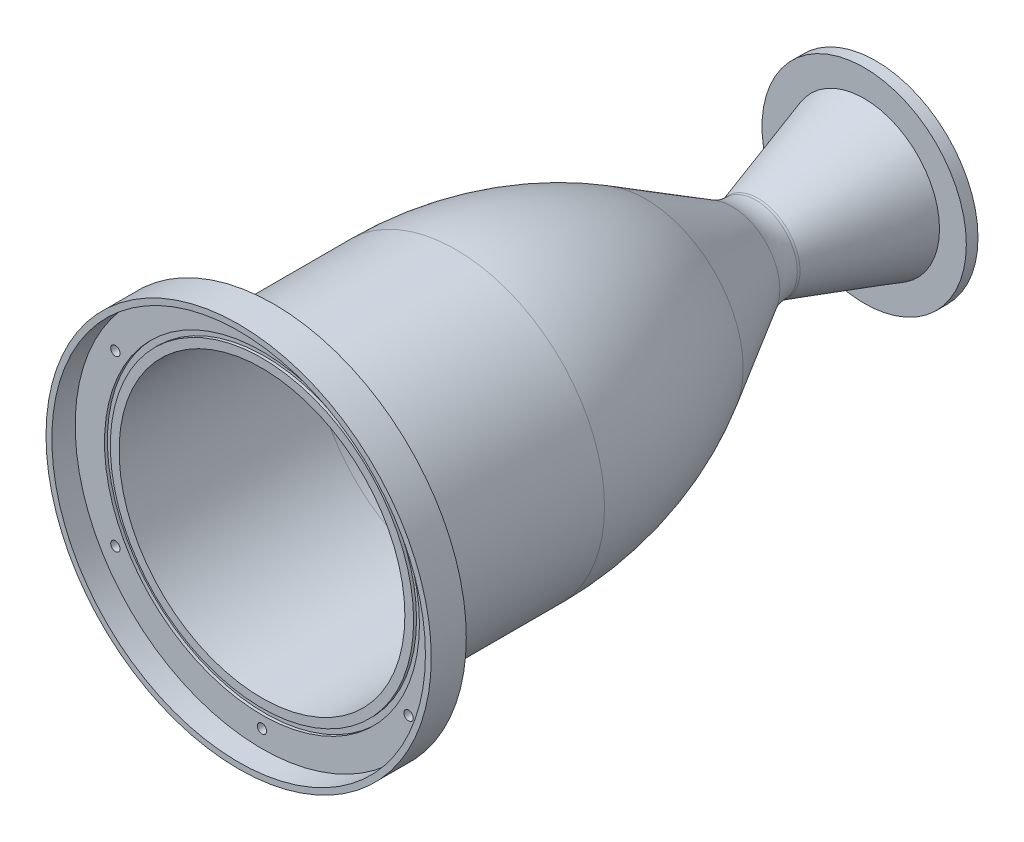
ISO-10303-21;
HEADER;
FILE_DESCRIPTION(('STEP AP214'),'2;1');
FILE_NAME('part.step','',(''),(''),'','','');
FILE_SCHEMA(('AUTOMOTIVE_DESIGN { 1 0 10303 214 1 1 1 1 }'));
ENDSEC;
DATA;
#1=APPLICATION_CONTEXT('core data for automotive mechanical design processes');
#2=APPLICATION_PROTOCOL_DEFINITION('international standard','automotive_design',2000,#1);
#3=PRODUCT_CONTEXT('',#1,'mechanical');
#4=PRODUCT('Part','Part','',(#3));
#5=PRODUCT_RELATED_PRODUCT_CATEGORY('part','',(#4));
#6=PRODUCT_DEFINITION_FORMATION('','',#4);
#7=PRODUCT_DEFINITION_CONTEXT('part definition',#1,'design');
#8=PRODUCT_DEFINITION('design','',#6,#7);
#9=PRODUCT_DEFINITION_SHAPE('','',#8);
#10=(LENGTH_UNIT() NAMED_UNIT(*) SI_UNIT(.MILLI.,.METRE.));
#11=(NAMED_UNIT(*) PLANE_ANGLE_UNIT() SI_UNIT($,.RADIAN.));
#12=(NAMED_UNIT(*) SI_UNIT($,.STERADIAN.) SOLID_ANGLE_UNIT());
#13=UNCERTAINTY_MEASURE_WITH_UNIT(LENGTH_MEASURE(1.E-05),#10,'distance_accuracy_value','');
#14=(GEOMETRIC_REPRESENTATION_CONTEXT(3) GLOBAL_UNCERTAINTY_ASSIGNED_CONTEXT((#13)) GLOBAL_UNIT_ASSIGNED_CONTEXT((#10,
#11,#12)) REPRESENTATION_CONTEXT('',''));
#15=CARTESIAN_POINT('',(0.,0.,0.));
#16=DIRECTION('',(0.,0.,1.));
#17=DIRECTION('',(1.,0.,0.));
#18=AXIS2_PLACEMENT_3D('',#15,#16,#17);
#19=CARTESIAN_POINT('',(0.,24.479181,0.));
#20=DIRECTION('',(0.,0.,-1.));
#21=DIRECTION('',(-1.,0.,0.));
#22=AXIS2_PLACEMENT_3D('',#19,#20,#21);
#23=PLANE('',#22);
#24=CARTESIAN_POINT('',(0.,0.,0.));
#25=DIRECTION('',(0.,0.,1.));
#26=DIRECTION('',(1.,0.,0.));
#27=AXIS2_PLACEMENT_3D('',#24,#25,#26);
#28=CIRCLE('',#27,25.9791805);
#29=CARTESIAN_POINT('',(25.9791805,0.,0.));
#30=VERTEX_POINT('',#29);
#31=EDGE_CURVE('E136',#30,#30,#28,.T.);
#32=ORIENTED_EDGE('',*,*,#31,.T.);
#33=EDGE_LOOP('',(#32));
#34=FACE_BOUND('',#33,.T.);
#35=CARTESIAN_POINT('',(0.,0.,0.));
#36=DIRECTION('',(0.,0.,1.));
#37=DIRECTION('',(1.,0.,0.));
#38=AXIS2_PLACEMENT_3D('',#35,#36,#37);
#39=CIRCLE('',#38,24.479181);
#40=CARTESIAN_POINT('',(24.479181,0.,0.));
#41=VERTEX_POINT('',#40);
#42=EDGE_CURVE('E11',#41,#41,#39,.T.);
#43=ORIENTED_EDGE('',*,*,#42,.F.);
#44=EDGE_LOOP('',(#43));
#45=FACE_BOUND('',#44,.T.);
#46=ADVANCED_FACE('F40',(#34,#45),#23,.F.);
#47=CARTESIAN_POINT('',(0.,0.,0.));
#48=DIRECTION('',(0.,0.,1.));
#49=DIRECTION('',(1.,0.,0.));
#50=AXIS2_PLACEMENT_3D('',#47,#48,#49);
#51=CIRCLE('',#50,26.9791805);
#52=CARTESIAN_POINT('',(26.9791805,0.,0.));
#53=VERTEX_POINT('',#52);
#54=EDGE_CURVE('E455',#53,#53,#51,.T.);
#55=ORIENTED_EDGE('',*,*,#54,.F.);
#56=EDGE_LOOP('',(#55));
#57=FACE_BOUND('',#56,.T.);
#58=CARTESIAN_POINT('',(-25.1147367097486,14.5000000000003,0.));
#59=DIRECTION('',(0.,0.,1.));
#60=DIRECTION('',(1.,0.,0.));
#61=AXIS2_PLACEMENT_3D('',#58,#59,#60);
#62=CIRCLE('',#61,0.799999999999988);
#63=CARTESIAN_POINT('',(-24.3147367097486,14.5000000000003,0.));
#64=VERTEX_POINT('',#63);
#65=EDGE_CURVE('E138',#64,#64,#62,.T.);
#66=ORIENTED_EDGE('',*,*,#65,.F.);
#67=EDGE_LOOP('',(#66));
#68=FACE_BOUND('',#67,.T.);
#69=CARTESIAN_POINT('',(-25.1147367097489,-14.4999999999998,0.));
#70=DIRECTION('',(0.,0.,1.));
#71=DIRECTION('',(1.,0.,0.));
#72=AXIS2_PLACEMENT_3D('',#69,#70,#71);
#73=CIRCLE('',#72,0.799999999999988);
#74=CARTESIAN_POINT('',(-24.3147367097489,-14.4999999999998,0.));
#75=VERTEX_POINT('',#74);
#76=EDGE_CURVE('E76',#75,#75,#73,.T.);
#77=ORIENTED_EDGE('',*,*,#76,.F.);
#78=EDGE_LOOP('',(#77));
#79=FACE_BOUND('',#78,.T.);
#80=CARTESIAN_POINT('',(0.,-29.,0.));
#81=DIRECTION('',(0.,0.,1.));
#82=DIRECTION('',(1.,0.,0.));
#83=AXIS2_PLACEMENT_3D('',#80,#81,#82);
#84=CIRCLE('',#83,0.799999999999987);
#85=CARTESIAN_POINT('',(0.799999999999987,-29.,0.));
#86=VERTEX_POINT('',#85);
#87=EDGE_CURVE('E64',#86,#86,#84,.T.);
#88=ORIENTED_EDGE('',*,*,#87,.F.);
#89=EDGE_LOOP('',(#88));
#90=FACE_BOUND('',#89,.T.);
#91=CARTESIAN_POINT('',(25.1147367097487,-14.5000000000001,0.));
#92=DIRECTION('',(0.,0.,1.));
#93=DIRECTION('',(1.,0.,0.));
#94=AXIS2_PLACEMENT_3D('',#91,#92,#93);
#95=CIRCLE('',#94,0.799999999999988);
#96=CARTESIAN_POINT('',(25.9147367097486,-14.5000000000001,0.));
#97=VERTEX_POINT('',#96);
#98=EDGE_CURVE('E63',#97,#97,#95,.T.);
#99=ORIENTED_EDGE('',*,*,#98,.F.);
#100=EDGE_LOOP('',(#99));
#101=FACE_BOUND('',#100,.T.);
#102=CARTESIAN_POINT('',(25.1147367097488,14.4999999999999,0.));
#103=DIRECTION('',(0.,0.,1.));
#104=DIRECTION('',(1.,0.,0.));
#105=AXIS2_PLACEMENT_3D('',#102,#103,#104);
#106=CIRCLE('',#105,0.799999999999988);
#107=CARTESIAN_POINT('',(25.9147367097487,14.4999999999999,0.));
#108=VERTEX_POINT('',#107);
#109=EDGE_CURVE('E82',#108,#108,#106,.T.);
#110=ORIENTED_EDGE('',*,*,#109,.F.);
#111=EDGE_LOOP('',(#110));
#112=FACE_BOUND('',#111,.T.);
#113=CARTESIAN_POINT('',(0.,29.,0.));
#114=DIRECTION('',(0.,0.,1.));
#115=DIRECTION('',(1.,0.,0.));
#116=AXIS2_PLACEMENT_3D('',#113,#114,#115);
#117=CIRCLE('',#116,0.799999999999987);
#118=CARTESIAN_POINT('',(0.799999999999987,29.,0.));
#119=VERTEX_POINT('',#118);
#120=EDGE_CURVE('E60',#119,#119,#117,.T.);
#121=ORIENTED_EDGE('',*,*,#120,.F.);
#122=EDGE_LOOP('',(#121));
#123=FACE_BOUND('',#122,.T.);
#124=CARTESIAN_POINT('',(0.,0.,0.));
#125=DIRECTION('',(0.,0.,1.));
#126=DIRECTION('',(1.,0.,0.));
#127=AXIS2_PLACEMENT_3D('',#124,#125,#126);
#128=CIRCLE('',#127,32.);
#129=CARTESIAN_POINT('',(32.,0.,0.));
#130=VERTEX_POINT('',#129);
#131=EDGE_CURVE('E59',#130,#130,#128,.T.);
#132=ORIENTED_EDGE('',*,*,#131,.T.);
#133=EDGE_LOOP('',(#132));
#134=FACE_BOUND('',#133,.T.);
#135=ADVANCED_FACE('F42',(#57,#68,#79,#90,#101,#112,#123,#134),#23,.F.);
#136=CARTESIAN_POINT('',(0.,0.,0.));
#137=DIRECTION('',(0.,0.,1.));
#138=DIRECTION('',(1.,0.,0.));
#139=AXIS2_PLACEMENT_3D('',#136,#137,#138);
#140=CYLINDRICAL_SURFACE('',#139,24.4791805);
#141=CARTESIAN_POINT('',(0.,0.,-33.202143));
#142=DIRECTION('',(0.,0.,1.));
#143=DIRECTION('',(1.,0.,0.));
#144=AXIS2_PLACEMENT_3D('',#141,#142,#143);
#145=CIRCLE('',#144,24.47918);
#146=CARTESIAN_POINT('',(24.47918,0.,-33.202143));
#147=VERTEX_POINT('',#146);
#148=EDGE_CURVE('E48',#147,#147,#145,.T.);
#149=ORIENTED_EDGE('',*,*,#148,.F.);
#150=EDGE_LOOP('',(#149));
#151=FACE_BOUND('',#150,.T.);
#152=ORIENTED_EDGE('',*,*,#42,.T.);
#153=EDGE_LOOP('',(#152));
#154=FACE_BOUND('',#153,.T.);
#155=ADVANCED_FACE('F120',(#151,#154),#140,.F.);
#156=CARTESIAN_POINT('',(0.,0.,-33.202143));
#157=DIRECTION('',(0.,0.,1.));
#158=DIRECTION('',(1.,0.,0.));
#159=AXIS2_PLACEMENT_3D('',#156,#157,#158);
#160=DEGENERATE_TOROIDAL_SURFACE('',#159,39.449133,63.928313,.F.);
#161=CARTESIAN_POINT('',(0.,0.,-65.1662995));
#162=DIRECTION('',(0.,0.,1.));
#163=DIRECTION('',(1.,0.,0.));
#164=AXIS2_PLACEMENT_3D('',#161,#162,#163);
#165=CIRCLE('',#164,15.914410079083);
#166=CARTESIAN_POINT('',(15.914410079083,0.,-65.1662995));
#167=VERTEX_POINT('',#166);
#168=EDGE_CURVE('E53',#167,#167,#165,.T.);
#169=ORIENTED_EDGE('',*,*,#168,.F.);
#170=EDGE_LOOP('',(#169));
#171=FACE_BOUND('',#170,.T.);
#172=ORIENTED_EDGE('',*,*,#148,.T.);
#173=EDGE_LOOP('',(#172));
#174=FACE_BOUND('',#173,.T.);
#175=ADVANCED_FACE('F117',(#171,#174),#160,.T.);
#176=CARTESIAN_POINT('',(0.,0.,-65.1662995));
#177=DIRECTION('',(0.,0.,1.));
#178=DIRECTION('',(1.,0.,0.));
#179=AXIS2_PLACEMENT_3D('',#176,#177,#178);
#180=CONICAL_SURFACE('',#179,15.914410079083,0.523598737654097);
#181=CARTESIAN_POINT('',(0.,0.,-80.000916));
#182=DIRECTION('',(0.,0.,1.));
#183=DIRECTION('',(1.,0.,0.));
#184=AXIS2_PLACEMENT_3D('',#181,#182,#183);
#185=CIRCLE('',#184,7.349641);
#186=CARTESIAN_POINT('',(7.349641,0.,-80.000916));
#187=VERTEX_POINT('',#186);
#188=EDGE_CURVE('E256',#187,#187,#185,.T.);
#189=ORIENTED_EDGE('',*,*,#188,.F.);
#190=EDGE_LOOP('',(#189));
#191=FACE_BOUND('',#190,.T.);
#192=ORIENTED_EDGE('',*,*,#168,.T.);
#193=EDGE_LOOP('',(#192));
#194=FACE_BOUND('',#193,.T.);
#195=ADVANCED_FACE('F113',(#191,#194),#180,.F.);
#196=CARTESIAN_POINT('',(0.,0.,-84.5907630836009));
#197=DIRECTION('',(0.,0.,1.));
#198=DIRECTION('',(1.,0.,0.));
#199=AXIS2_PLACEMENT_3D('',#196,#197,#198);
#200=TOROIDAL_SURFACE('',#199,15.299488,9.17969299999999);
#201=CARTESIAN_POINT('',(0.,0.,-84.5907630000001));
#202=DIRECTION('',(0.,0.,1.));
#203=DIRECTION('',(1.,0.,0.));
#204=AXIS2_PLACEMENT_3D('',#201,#202,#203);
#205=CIRCLE('',#204,6.119795);
#206=CARTESIAN_POINT('',(6.119795,0.,-84.5907630000001));
#207=VERTEX_POINT('',#206);
#208=EDGE_CURVE('E253',#207,#207,#205,.T.);
#209=ORIENTED_EDGE('',*,*,#208,.F.);
#210=EDGE_LOOP('',(#209));
#211=FACE_BOUND('',#210,.T.);
#212=ORIENTED_EDGE('',*,*,#188,.T.);
#213=EDGE_LOOP('',(#212));
#214=FACE_BOUND('',#213,.T.);
#215=ADVANCED_FACE('F109',(#211,#214),#200,.T.);
#216=CARTESIAN_POINT('',(0.,0.,-84.590763));
#217=DIRECTION('',(0.,0.,1.));
#218=DIRECTION('',(1.,0.,0.));
#219=AXIS2_PLACEMENT_3D('',#216,#217,#218);
#220=TOROIDAL_SURFACE('',#219,8.457557,2.337762);
#221=CARTESIAN_POINT('',(0.,0.,-85.3098501774056));
#222=DIRECTION('',(0.,0.,1.));
#223=DIRECTION('',(1.,0.,0.));
#224=AXIS2_PLACEMENT_3D('',#221,#222,#223);
#225=CIRCLE('',#224,6.23313689580772);
#226=CARTESIAN_POINT('',(6.23313689580772,0.,-85.3098501774056));
#227=VERTEX_POINT('',#226);
#228=EDGE_CURVE('E245',#227,#227,#225,.T.);
#229=ORIENTED_EDGE('',*,*,#228,.F.);
#230=EDGE_LOOP('',(#229));
#231=FACE_BOUND('',#230,.T.);
#232=ORIENTED_EDGE('',*,*,#208,.T.);
#233=EDGE_LOOP('',(#232));
#234=FACE_BOUND('',#233,.T.);
#235=ADVANCED_FACE('F104',(#231,#234),#220,.T.);
#236=CARTESIAN_POINT('',(0.,-318657.489382053,947759.436280588));
#237=CARTESIAN_POINT('',(0.,318787.335951098,-947936.770074312));
#238=CARTESIAN_POINT('',(0.,-318866.290861776,947689.212113303));
#239=B_SPLINE_CURVE_WITH_KNOTS('',2,(#236,#237,#238),.UNSPECIFIED.,.F.,.F.,(3,3),(0.,1.),.UNSPECIFIED.);
#240=CARTESIAN_POINT('',(0.,0.,0.));
#241=DIRECTION('',(0.,0.,1.));
#242=AXIS1_PLACEMENT('',#240,#241);
#243=SURFACE_OF_REVOLUTION('',#239,#242);
#244=CARTESIAN_POINT('',(0.,0.,-105.161240485212));
#245=DIRECTION('',(0.,0.,1.));
#246=DIRECTION('',(1.,0.,0.));
#247=AXIS2_PLACEMENT_3D('',#244,#245,#246);
#248=CIRCLE('',#247,12.4867024815896);
#249=CARTESIAN_POINT('',(12.4867024815896,0.,-105.161240485212));
#250=VERTEX_POINT('',#249);
#251=EDGE_CURVE('E242',#250,#250,#248,.T.);
#252=ORIENTED_EDGE('',*,*,#251,.F.);
#253=EDGE_LOOP('',(#252));
#254=FACE_BOUND('',#253,.T.);
#255=ORIENTED_EDGE('',*,*,#228,.T.);
#256=EDGE_LOOP('',(#255));
#257=FACE_BOUND('',#256,.T.);
#258=ADVANCED_FACE('F99',(#254,#257),#243,.T.);
#259=CARTESIAN_POINT('',(0.,12.4867024816134,-105.161240485253));
#260=DIRECTION('',(0.,0.,1.));
#261=DIRECTION('',(1.,0.,0.));
#262=AXIS2_PLACEMENT_3D('',#259,#260,#261);
#263=PLANE('',#262);
#264=CARTESIAN_POINT('',(0.,0.,-105.161240485293));
#265=DIRECTION('',(0.,0.,1.));
#266=DIRECTION('',(1.,0.,0.));
#267=AXIS2_PLACEMENT_3D('',#264,#265,#266);
#268=CIRCLE('',#267,17.5);
#269=CARTESIAN_POINT('',(17.5,0.,-105.161240485293));
#270=VERTEX_POINT('',#269);
#271=EDGE_CURVE('E241',#270,#270,#268,.T.);
#272=ORIENTED_EDGE('',*,*,#271,.F.);
#273=EDGE_LOOP('',(#272));
#274=FACE_BOUND('',#273,.T.);
#275=ORIENTED_EDGE('',*,*,#251,.T.);
#276=EDGE_LOOP('',(#275));
#277=FACE_BOUND('',#276,.T.);
#278=ADVANCED_FACE('F103',(#274,#277),#263,.F.);
#279=CARTESIAN_POINT('',(0.,0.,0.));
#280=DIRECTION('',(0.,0.,1.));
#281=DIRECTION('',(1.,0.,0.));
#282=AXIS2_PLACEMENT_3D('',#279,#280,#281);
#283=CYLINDRICAL_SURFACE('',#282,17.5);
#284=CARTESIAN_POINT('',(0.,0.,-103.1612404853));
#285=DIRECTION('',(0.,0.,1.));
#286=DIRECTION('',(1.,0.,0.));
#287=AXIS2_PLACEMENT_3D('',#284,#285,#286);
#288=CIRCLE('',#287,17.5);
#289=CARTESIAN_POINT('',(17.5,0.,-103.1612404853));
#290=VERTEX_POINT('',#289);
#291=EDGE_CURVE('E238',#290,#290,#288,.T.);
#292=ORIENTED_EDGE('',*,*,#291,.F.);
#293=EDGE_LOOP('',(#292));
#294=FACE_BOUND('',#293,.T.);
#295=ORIENTED_EDGE('',*,*,#271,.T.);
#296=EDGE_LOOP('',(#295));
#297=FACE_BOUND('',#296,.T.);
#298=ADVANCED_FACE('F227',(#294,#297),#283,.T.);
#299=CARTESIAN_POINT('',(0.,12.9051094669874,-103.1612404853));
#300=DIRECTION('',(0.,0.,-1.));
#301=DIRECTION('',(-1.,0.,0.));
#302=AXIS2_PLACEMENT_3D('',#299,#300,#301);
#303=PLANE('',#302);
#304=CARTESIAN_POINT('',(0.,0.,-103.1612404853));
#305=DIRECTION('',(0.,0.,1.));
#306=DIRECTION('',(1.,0.,0.));
#307=AXIS2_PLACEMENT_3D('',#304,#305,#306);
#308=CIRCLE('',#307,12.9051094669874);
#309=CARTESIAN_POINT('',(12.9051094669874,0.,-103.1612404853));
#310=VERTEX_POINT('',#309);
#311=EDGE_CURVE('E247',#310,#310,#308,.T.);
#312=ORIENTED_EDGE('',*,*,#311,.F.);
#313=EDGE_LOOP('',(#312));
#314=FACE_BOUND('',#313,.T.);
#315=ORIENTED_EDGE('',*,*,#291,.T.);
#316=EDGE_LOOP('',(#315));
#317=FACE_BOUND('',#316,.T.);
#318=ADVANCED_FACE('F224',(#314,#317),#303,.F.);
#319=CARTESIAN_POINT('',(0.,0.,-103.1612404853));
#320=DIRECTION('',(0.,0.,-1.));
#321=DIRECTION('',(-1.,0.,0.));
#322=AXIS2_PLACEMENT_3D('',#319,#320,#321);
#323=CONICAL_SURFACE('',#322,12.9051094669874,0.305178130617538);
#324=CARTESIAN_POINT('',(0.,0.,-84.9926913995637));
#325=DIRECTION('',(0.,0.,1.));
#326=DIRECTION('',(1.,0.,0.));
#327=AXIS2_PLACEMENT_3D('',#324,#325,#326);
#328=CIRCLE('',#327,7.1816708793407);
#329=CARTESIAN_POINT('',(7.1816708793407,0.,-84.9926913995637));
#330=VERTEX_POINT('',#329);
#331=EDGE_CURVE('E270',#330,#330,#328,.T.);
#332=ORIENTED_EDGE('',*,*,#331,.F.);
#333=EDGE_LOOP('',(#332));
#334=FACE_BOUND('',#333,.T.);
#335=ORIENTED_EDGE('',*,*,#311,.T.);
#336=EDGE_LOOP('',(#335));
#337=FACE_BOUND('',#336,.T.);
#338=ADVANCED_FACE('F220',(#334,#337),#323,.T.);
#339=CARTESIAN_POINT('',(0.,0.,-84.590763));
#340=DIRECTION('',(0.,0.,1.));
#341=DIRECTION('',(1.,0.,0.));
#342=AXIS2_PLACEMENT_3D('',#339,#340,#341);
#343=TOROIDAL_SURFACE('',#342,8.457557,1.33769646454899);
#344=CARTESIAN_POINT('',(0.,0.,-84.5907629836548));
#345=DIRECTION('',(0.,0.,1.));
#346=DIRECTION('',(1.,0.,0.));
#347=AXIS2_PLACEMENT_3D('',#344,#345,#346);
#348=CIRCLE('',#347,7.11986053545101);
#349=CARTESIAN_POINT('',(7.11986053545101,0.,-84.5907629836548));
#350=VERTEX_POINT('',#349);
#351=EDGE_CURVE('E273',#350,#350,#348,.T.);
#352=ORIENTED_EDGE('',*,*,#351,.F.);
#353=EDGE_LOOP('',(#352));
#354=FACE_BOUND('',#353,.T.);
#355=ORIENTED_EDGE('',*,*,#331,.T.);
#356=EDGE_LOOP('',(#355));
#357=FACE_BOUND('',#356,.T.);
#358=ADVANCED_FACE('F216',(#354,#357),#343,.F.);
#359=CARTESIAN_POINT('',(0.,0.,-84.5907630836009));
#360=DIRECTION('',(0.,0.,1.));
#361=DIRECTION('',(1.,0.,0.));
#362=AXIS2_PLACEMENT_3D('',#359,#360,#361);
#363=TOROIDAL_SURFACE('',#362,15.299488,8.17962746454899);
#364=CARTESIAN_POINT('',(0.,0.,-80.5009763079727));
#365=DIRECTION('',(0.,0.,1.));
#366=DIRECTION('',(1.,0.,0.));
#367=AXIS2_PLACEMENT_3D('',#364,#365,#366);
#368=CIRCLE('',#367,8.21570725884909);
#369=CARTESIAN_POINT('',(8.21570725884909,0.,-80.5009763079727));
#370=VERTEX_POINT('',#369);
#371=EDGE_CURVE('E276',#370,#370,#368,.T.);
#372=ORIENTED_EDGE('',*,*,#371,.F.);
#373=EDGE_LOOP('',(#372));
#374=FACE_BOUND('',#373,.T.);
#375=ORIENTED_EDGE('',*,*,#351,.T.);
#376=EDGE_LOOP('',(#375));
#377=FACE_BOUND('',#376,.T.);
#378=ADVANCED_FACE('F212',(#374,#377),#363,.F.);
#379=CARTESIAN_POINT('',(0.,0.,-80.5009763079727));
#380=DIRECTION('',(0.,0.,1.));
#381=DIRECTION('',(1.,0.,0.));
#382=AXIS2_PLACEMENT_3D('',#379,#380,#381);
#383=CONICAL_SURFACE('',#382,8.21570725884909,0.523594970190303);
#384=CARTESIAN_POINT('',(0.,0.,-65.6660860233121));
#385=DIRECTION('',(0.,0.,1.));
#386=DIRECTION('',(1.,0.,0.));
#387=AXIS2_PLACEMENT_3D('',#384,#385,#386);
#388=CIRCLE('',#387,16.7805598878483);
#389=CARTESIAN_POINT('',(16.7805598878483,0.,-65.6660860233121));
#390=VERTEX_POINT('',#389);
#391=EDGE_CURVE('E279',#390,#390,#388,.T.);
#392=ORIENTED_EDGE('',*,*,#391,.F.);
#393=EDGE_LOOP('',(#392));
#394=FACE_BOUND('',#393,.T.);
#395=ORIENTED_EDGE('',*,*,#371,.T.);
#396=EDGE_LOOP('',(#395));
#397=FACE_BOUND('',#396,.T.);
#398=ADVANCED_FACE('F208',(#394,#397),#383,.T.);
#399=CARTESIAN_POINT('',(0.,0.,-33.202143));
#400=DIRECTION('',(0.,0.,1.));
#401=DIRECTION('',(1.,0.,0.));
#402=AXIS2_PLACEMENT_3D('',#399,#400,#401);
#403=DEGENERATE_TOROIDAL_SURFACE('',#402,39.449133,64.928314,.F.);
#404=CARTESIAN_POINT('',(0.,0.,-33.202143));
#405=DIRECTION('',(0.,0.,1.));
#406=DIRECTION('',(1.,0.,0.));
#407=AXIS2_PLACEMENT_3D('',#404,#405,#406);
#408=CIRCLE('',#407,25.479181);
#409=CARTESIAN_POINT('',(25.479181,0.,-33.202143));
#410=VERTEX_POINT('',#409);
#411=EDGE_CURVE('E282',#410,#410,#408,.T.);
#412=ORIENTED_EDGE('',*,*,#411,.F.);
#413=EDGE_LOOP('',(#412));
#414=FACE_BOUND('',#413,.T.);
#415=ORIENTED_EDGE('',*,*,#391,.T.);
#416=EDGE_LOOP('',(#415));
#417=FACE_BOUND('',#416,.T.);
#418=ADVANCED_FACE('F204',(#414,#417),#403,.F.);
#419=CARTESIAN_POINT('',(0.,0.,0.));
#420=DIRECTION('',(0.,0.,1.));
#421=DIRECTION('',(1.,0.,0.));
#422=AXIS2_PLACEMENT_3D('',#419,#420,#421);
#423=CYLINDRICAL_SURFACE('',#422,25.479181);
#424=CARTESIAN_POINT('',(0.,0.,-2.));
#425=DIRECTION('',(0.,0.,1.));
#426=DIRECTION('',(1.,0.,0.));
#427=AXIS2_PLACEMENT_3D('',#424,#425,#426);
#428=CIRCLE('',#427,25.479181);
#429=CARTESIAN_POINT('',(25.479181,0.,-2.));
#430=VERTEX_POINT('',#429);
#431=EDGE_CURVE('E285',#430,#430,#428,.T.);
#432=ORIENTED_EDGE('',*,*,#431,.F.);
#433=EDGE_LOOP('',(#432));
#434=FACE_BOUND('',#433,.T.);
#435=ORIENTED_EDGE('',*,*,#411,.T.);
#436=EDGE_LOOP('',(#435));
#437=FACE_BOUND('',#436,.T.);
#438=ADVANCED_FACE('F201',(#434,#437),#423,.T.);
#439=CARTESIAN_POINT('',(0.,25.479181,-2.));
#440=DIRECTION('',(0.,0.,1.));
#441=DIRECTION('',(1.,0.,0.));
#442=AXIS2_PLACEMENT_3D('',#439,#440,#441);
#443=PLANE('',#442);
#444=CARTESIAN_POINT('',(-25.1147367097486,14.5000000000003,-2.));
#445=DIRECTION('',(0.,0.,1.));
#446=DIRECTION('',(1.,0.,0.));
#447=AXIS2_PLACEMENT_3D('',#444,#445,#446);
#448=CIRCLE('',#447,0.799999999999981);
#449=CARTESIAN_POINT('',(-24.3147367097486,14.5000000000003,-2.));
#450=VERTEX_POINT('',#449);
#451=EDGE_CURVE('E44',#450,#450,#448,.T.);
#452=ORIENTED_EDGE('',*,*,#451,.T.);
#453=EDGE_LOOP('',(#452));
#454=FACE_BOUND('',#453,.T.);
#455=CARTESIAN_POINT('',(-25.1147367097489,-14.4999999999998,-2.));
#456=DIRECTION('',(0.,0.,1.));
#457=DIRECTION('',(1.,0.,0.));
#458=AXIS2_PLACEMENT_3D('',#455,#456,#457);
#459=CIRCLE('',#458,0.799999999999981);
#460=CARTESIAN_POINT('',(-24.3147367097489,-14.4999999999998,-2.));
#461=VERTEX_POINT('',#460);
#462=EDGE_CURVE('E71',#461,#461,#459,.T.);
#463=ORIENTED_EDGE('',*,*,#462,.T.);
#464=EDGE_LOOP('',(#463));
#465=FACE_BOUND('',#464,.T.);
#466=CARTESIAN_POINT('',(0.,-29.,-2.));
#467=DIRECTION('',(0.,0.,1.));
#468=DIRECTION('',(1.,0.,0.));
#469=AXIS2_PLACEMENT_3D('',#466,#467,#468);
#470=CIRCLE('',#469,0.799999999999981);
#471=CARTESIAN_POINT('',(0.799999999999981,-29.,-2.));
#472=VERTEX_POINT('',#471);
#473=EDGE_CURVE('E61',#472,#472,#470,.T.);
#474=ORIENTED_EDGE('',*,*,#473,.T.);
#475=EDGE_LOOP('',(#474));
#476=FACE_BOUND('',#475,.T.);
#477=CARTESIAN_POINT('',(25.1147367097487,-14.5000000000001,-2.));
#478=DIRECTION('',(0.,0.,1.));
#479=DIRECTION('',(1.,0.,0.));
#480=AXIS2_PLACEMENT_3D('',#477,#478,#479);
#481=CIRCLE('',#480,0.799999999999981);
#482=CARTESIAN_POINT('',(25.9147367097486,-14.5000000000001,-2.));
#483=VERTEX_POINT('',#482);
#484=EDGE_CURVE('E68',#483,#483,#481,.T.);
#485=ORIENTED_EDGE('',*,*,#484,.T.);
#486=EDGE_LOOP('',(#485));
#487=FACE_BOUND('',#486,.T.);
#488=CARTESIAN_POINT('',(25.1147367097488,14.4999999999999,-2.));
#489=DIRECTION('',(0.,0.,1.));
#490=DIRECTION('',(1.,0.,0.));
#491=AXIS2_PLACEMENT_3D('',#488,#489,#490);
#492=CIRCLE('',#491,0.799999999999981);
#493=CARTESIAN_POINT('',(25.9147367097487,14.4999999999999,-2.));
#494=VERTEX_POINT('',#493);
#495=EDGE_CURVE('E85',#494,#494,#492,.T.);
#496=ORIENTED_EDGE('',*,*,#495,.T.);
#497=EDGE_LOOP('',(#496));
#498=FACE_BOUND('',#497,.T.);
#499=CARTESIAN_POINT('',(0.,29.,-2.));
#500=DIRECTION('',(0.,0.,1.));
#501=DIRECTION('',(1.,0.,0.));
#502=AXIS2_PLACEMENT_3D('',#499,#500,#501);
#503=CIRCLE('',#502,0.799999999999981);
#504=CARTESIAN_POINT('',(0.799999999999981,29.,-2.));
#505=VERTEX_POINT('',#504);
#506=EDGE_CURVE('E57',#505,#505,#503,.T.);
#507=ORIENTED_EDGE('',*,*,#506,.T.);
#508=EDGE_LOOP('',(#507));
#509=FACE_BOUND('',#508,.T.);
#510=CARTESIAN_POINT('',(0.,0.,-2.));
#511=DIRECTION('',(0.,0.,1.));
#512=DIRECTION('',(1.,0.,0.));
#513=AXIS2_PLACEMENT_3D('',#510,#511,#512);
#514=CIRCLE('',#513,33.);
#515=CARTESIAN_POINT('',(33.,0.,-2.));
#516=VERTEX_POINT('',#515);
#517=EDGE_CURVE('E288',#516,#516,#514,.T.);
#518=ORIENTED_EDGE('',*,*,#517,.F.);
#519=EDGE_LOOP('',(#518));
#520=FACE_BOUND('',#519,.T.);
#521=ORIENTED_EDGE('',*,*,#431,.T.);
#522=EDGE_LOOP('',(#521));
#523=FACE_BOUND('',#522,.T.);
#524=ADVANCED_FACE('F153',(#454,#465,#476,#487,#498,#509,#520,#523),#443,.F.);
#525=CARTESIAN_POINT('',(0.,0.,0.));
#526=DIRECTION('',(0.,0.,1.));
#527=DIRECTION('',(1.,0.,0.));
#528=AXIS2_PLACEMENT_3D('',#525,#526,#527);
#529=CYLINDRICAL_SURFACE('',#528,33.);
#530=CARTESIAN_POINT('',(0.,0.,4.));
#531=DIRECTION('',(0.,0.,1.));
#532=DIRECTION('',(1.,0.,0.));
#533=AXIS2_PLACEMENT_3D('',#530,#531,#532);
#534=CIRCLE('',#533,33.);
#535=CARTESIAN_POINT('',(33.,0.,4.));
#536=VERTEX_POINT('',#535);
#537=EDGE_CURVE('E291',#536,#536,#534,.T.);
#538=ORIENTED_EDGE('',*,*,#537,.F.);
#539=EDGE_LOOP('',(#538));
#540=FACE_BOUND('',#539,.T.);
#541=ORIENTED_EDGE('',*,*,#517,.T.);
#542=EDGE_LOOP('',(#541));
#543=FACE_BOUND('',#542,.T.);
#544=ADVANCED_FACE('F194',(#540,#543),#529,.T.);
#545=CARTESIAN_POINT('',(0.,32.,4.));
#546=DIRECTION('',(0.,0.,-1.));
#547=DIRECTION('',(-1.,0.,0.));
#548=AXIS2_PLACEMENT_3D('',#545,#546,#547);
#549=PLANE('',#548);
#550=CARTESIAN_POINT('',(0.,0.,4.));
#551=DIRECTION('',(0.,0.,1.));
#552=DIRECTION('',(1.,0.,0.));
#553=AXIS2_PLACEMENT_3D('',#550,#551,#552);
#554=CIRCLE('',#553,32.);
#555=CARTESIAN_POINT('',(32.,0.,4.));
#556=VERTEX_POINT('',#555);
#557=EDGE_CURVE('E293',#556,#556,#554,.T.);
#558=ORIENTED_EDGE('',*,*,#557,.F.);
#559=EDGE_LOOP('',(#558));
#560=FACE_BOUND('',#559,.T.);
#561=ORIENTED_EDGE('',*,*,#537,.T.);
#562=EDGE_LOOP('',(#561));
#563=FACE_BOUND('',#562,.T.);
#564=ADVANCED_FACE('F190',(#560,#563),#549,.F.);
#565=CARTESIAN_POINT('',(0.,0.,0.));
#566=DIRECTION('',(0.,0.,1.));
#567=DIRECTION('',(1.,0.,0.));
#568=AXIS2_PLACEMENT_3D('',#565,#566,#567);
#569=CYLINDRICAL_SURFACE('',#568,32.);
#570=ORIENTED_EDGE('',*,*,#131,.F.);
#571=EDGE_LOOP('',(#570));
#572=FACE_BOUND('',#571,.T.);
#573=ORIENTED_EDGE('',*,*,#557,.T.);
#574=EDGE_LOOP('',(#573));
#575=FACE_BOUND('',#574,.T.);
#576=ADVANCED_FACE('F186',(#572,#575),#569,.F.);
#577=CARTESIAN_POINT('',(0.,29.,0.));
#578=DIRECTION('',(0.,0.,1.));
#579=DIRECTION('',(1.,0.,0.));
#580=AXIS2_PLACEMENT_3D('',#577,#578,#579);
#581=CYLINDRICAL_SURFACE('',#580,0.799999999999981);
#582=ORIENTED_EDGE('',*,*,#120,.T.);
#583=EDGE_LOOP('',(#582));
#584=FACE_BOUND('',#583,.T.);
#585=ORIENTED_EDGE('',*,*,#506,.F.);
#586=EDGE_LOOP('',(#585));
#587=FACE_BOUND('',#586,.T.);
#588=ADVANCED_FACE('F182',(#584,#587),#581,.F.);
#589=CARTESIAN_POINT('',(25.1147367097488,14.4999999999999,0.));
#590=DIRECTION('',(0.,0.,1.));
#591=DIRECTION('',(1.,0.,0.));
#592=AXIS2_PLACEMENT_3D('',#589,#590,#591);
#593=CYLINDRICAL_SURFACE('',#592,0.799999999999981);
#594=ORIENTED_EDGE('',*,*,#109,.T.);
#595=EDGE_LOOP('',(#594));
#596=FACE_BOUND('',#595,.T.);
#597=ORIENTED_EDGE('',*,*,#495,.F.);
#598=EDGE_LOOP('',(#597));
#599=FACE_BOUND('',#598,.T.);
#600=ADVANCED_FACE('F178',(#596,#599),#593,.F.);
#601=CARTESIAN_POINT('',(25.1147367097487,-14.5000000000001,0.));
#602=DIRECTION('',(0.,0.,1.));
#603=DIRECTION('',(1.,0.,0.));
#604=AXIS2_PLACEMENT_3D('',#601,#602,#603);
#605=CYLINDRICAL_SURFACE('',#604,0.799999999999981);
#606=ORIENTED_EDGE('',*,*,#98,.T.);
#607=EDGE_LOOP('',(#606));
#608=FACE_BOUND('',#607,.T.);
#609=ORIENTED_EDGE('',*,*,#484,.F.);
#610=EDGE_LOOP('',(#609));
#611=FACE_BOUND('',#610,.T.);
#612=ADVANCED_FACE('F175',(#608,#611),#605,.F.);
#613=CARTESIAN_POINT('',(0.,-29.,0.));
#614=DIRECTION('',(0.,0.,1.));
#615=DIRECTION('',(1.,0.,0.));
#616=AXIS2_PLACEMENT_3D('',#613,#614,#615);
#617=CYLINDRICAL_SURFACE('',#616,0.799999999999981);
#618=ORIENTED_EDGE('',*,*,#87,.T.);
#619=EDGE_LOOP('',(#618));
#620=FACE_BOUND('',#619,.T.);
#621=ORIENTED_EDGE('',*,*,#473,.F.);
#622=EDGE_LOOP('',(#621));
#623=FACE_BOUND('',#622,.T.);
#624=ADVANCED_FACE('F169',(#620,#623),#617,.F.);
#625=CARTESIAN_POINT('',(-25.1147367097489,-14.4999999999998,0.));
#626=DIRECTION('',(0.,0.,1.));
#627=DIRECTION('',(1.,0.,0.));
#628=AXIS2_PLACEMENT_3D('',#625,#626,#627);
#629=CYLINDRICAL_SURFACE('',#628,0.799999999999981);
#630=ORIENTED_EDGE('',*,*,#76,.T.);
#631=EDGE_LOOP('',(#630));
#632=FACE_BOUND('',#631,.T.);
#633=ORIENTED_EDGE('',*,*,#462,.F.);
#634=EDGE_LOOP('',(#633));
#635=FACE_BOUND('',#634,.T.);
#636=ADVANCED_FACE('F159',(#632,#635),#629,.F.);
#637=CARTESIAN_POINT('',(-25.1147367097486,14.5000000000003,0.));
#638=DIRECTION('',(0.,0.,1.));
#639=DIRECTION('',(1.,0.,0.));
#640=AXIS2_PLACEMENT_3D('',#637,#638,#639);
#641=CYLINDRICAL_SURFACE('',#640,0.799999999999981);
#642=ORIENTED_EDGE('',*,*,#65,.T.);
#643=EDGE_LOOP('',(#642));
#644=FACE_BOUND('',#643,.T.);
#645=ORIENTED_EDGE('',*,*,#451,.F.);
#646=EDGE_LOOP('',(#645));
#647=FACE_BOUND('',#646,.T.);
#648=ADVANCED_FACE('F156',(#644,#647),#641,.F.);
#649=CARTESIAN_POINT('',(0.,0.,2.68609400020083));
#650=DIRECTION('',(0.,0.,1.));
#651=DIRECTION('',(1.,0.,0.));
#652=AXIS2_PLACEMENT_3D('',#649,#650,#651);
#653=CYLINDRICAL_SURFACE('',#652,25.9791805);
#654=CARTESIAN_POINT('',(0.,0.,-0.5));
#655=DIRECTION('',(0.,0.,1.));
#656=DIRECTION('',(1.,0.,0.));
#657=AXIS2_PLACEMENT_3D('',#654,#655,#656);
#658=CIRCLE('',#657,25.9791805);
#659=CARTESIAN_POINT('',(25.9791805,0.,-0.5));
#660=VERTEX_POINT('',#659);
#661=EDGE_CURVE('E139',#660,#660,#658,.T.);
#662=ORIENTED_EDGE('',*,*,#661,.T.);
#663=EDGE_LOOP('',(#662));
#664=FACE_BOUND('',#663,.T.);
#665=ORIENTED_EDGE('',*,*,#31,.F.);
#666=EDGE_LOOP('',(#665));
#667=FACE_BOUND('',#666,.T.);
#668=ADVANCED_FACE('F158',(#664,#667),#653,.T.);
#669=CARTESIAN_POINT('',(0.,26.9791805,-0.5));
#670=DIRECTION('',(0.,0.,1.));
#671=DIRECTION('',(1.,0.,0.));
#672=AXIS2_PLACEMENT_3D('',#669,#670,#671);
#673=PLANE('',#672);
#674=CARTESIAN_POINT('',(0.,0.,-0.5));
#675=DIRECTION('',(0.,0.,1.));
#676=DIRECTION('',(1.,0.,0.));
#677=AXIS2_PLACEMENT_3D('',#674,#675,#676);
#678=CIRCLE('',#677,26.9791805);
#679=CARTESIAN_POINT('',(26.9791805,0.,-0.5));
#680=VERTEX_POINT('',#679);
#681=EDGE_CURVE('E144',#680,#680,#678,.T.);
#682=ORIENTED_EDGE('',*,*,#681,.T.);
#683=EDGE_LOOP('',(#682));
#684=FACE_BOUND('',#683,.T.);
#685=ORIENTED_EDGE('',*,*,#661,.F.);
#686=EDGE_LOOP('',(#685));
#687=FACE_BOUND('',#686,.T.);
#688=ADVANCED_FACE('F166',(#684,#687),#673,.T.);
#689=CARTESIAN_POINT('',(0.,0.,2.68609400020083));
#690=DIRECTION('',(0.,0.,1.));
#691=DIRECTION('',(1.,0.,0.));
#692=AXIS2_PLACEMENT_3D('',#689,#690,#691);
#693=CYLINDRICAL_SURFACE('',#692,26.9791805);
#694=ORIENTED_EDGE('',*,*,#54,.T.);
#695=EDGE_LOOP('',(#694));
#696=FACE_BOUND('',#695,.T.);
#697=ORIENTED_EDGE('',*,*,#681,.F.);
#698=EDGE_LOOP('',(#697));
#699=FACE_BOUND('',#698,.T.);
#700=ADVANCED_FACE('F439',(#696,#699),#693,.F.);
#701=CLOSED_SHELL('',(#46,#135,#155,#175,#195,#215,#235,#258,#278,#298,#318,#338,#358,#378,#398,
#418,#438,#524,#544,#564,#576,#588,#600,#612,#624,#636,#648,#668,#688,#700));
#702=MANIFOLD_SOLID_BREP('B2',#701);
#703=ADVANCED_BREP_SHAPE_REPRESENTATION('',(#18,#702),#14);
#704=SHAPE_DEFINITION_REPRESENTATION(#9,#703);
ENDSEC;
END-ISO-10303-21;
